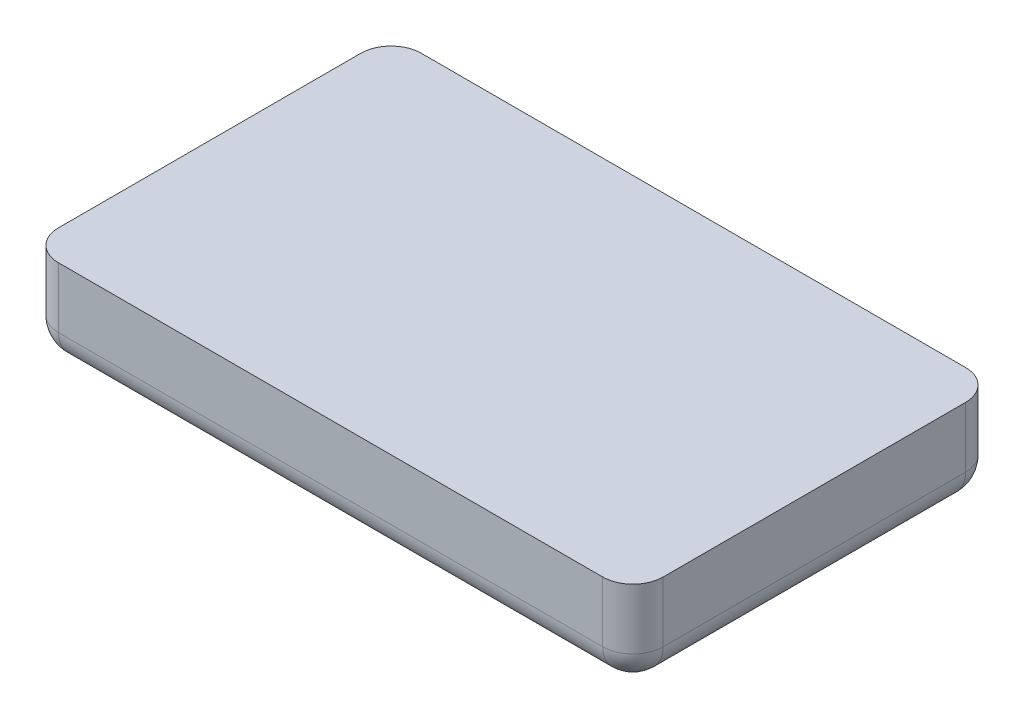
ISO-10303-21;
HEADER;
FILE_DESCRIPTION(('STEP AP214'),'2;1');
FILE_NAME('part.step','',(''),(''),'','','');
FILE_SCHEMA(('AUTOMOTIVE_DESIGN { 1 0 10303 214 1 1 1 1 }'));
ENDSEC;
DATA;
#1=APPLICATION_CONTEXT('core data for automotive mechanical design processes');
#2=APPLICATION_PROTOCOL_DEFINITION('international standard','automotive_design',2000,#1);
#3=PRODUCT_CONTEXT('',#1,'mechanical');
#4=PRODUCT('Part','Part','',(#3));
#5=PRODUCT_RELATED_PRODUCT_CATEGORY('part','',(#4));
#6=PRODUCT_DEFINITION_FORMATION('','',#4);
#7=PRODUCT_DEFINITION_CONTEXT('part definition',#1,'design');
#8=PRODUCT_DEFINITION('design','',#6,#7);
#9=PRODUCT_DEFINITION_SHAPE('','',#8);
#10=(LENGTH_UNIT() NAMED_UNIT(*) SI_UNIT(.MILLI.,.METRE.));
#11=(NAMED_UNIT(*) PLANE_ANGLE_UNIT() SI_UNIT($,.RADIAN.));
#12=(NAMED_UNIT(*) SI_UNIT($,.STERADIAN.) SOLID_ANGLE_UNIT());
#13=UNCERTAINTY_MEASURE_WITH_UNIT(LENGTH_MEASURE(1.E-05),#10,'distance_accuracy_value','');
#14=(GEOMETRIC_REPRESENTATION_CONTEXT(3) GLOBAL_UNCERTAINTY_ASSIGNED_CONTEXT((#13)) GLOBAL_UNIT_ASSIGNED_CONTEXT((#10,
#11,#12)) REPRESENTATION_CONTEXT('',''));
#15=CARTESIAN_POINT('',(0.,0.,0.));
#16=DIRECTION('',(0.,0.,1.));
#17=DIRECTION('',(1.,0.,0.));
#18=AXIS2_PLACEMENT_3D('',#15,#16,#17);
#19=CARTESIAN_POINT('',(0.,30.,0.));
#20=DIRECTION('',(1.,0.,0.));
#21=DIRECTION('',(0.,0.,-1.));
#22=AXIS2_PLACEMENT_3D('',#19,#20,#21);
#23=PLANE('',#22);
#24=DIRECTION('',(0.,0.,1.));
#25=VECTOR('',#24,1.);
#26=CARTESIAN_POINT('',(0.,30.,0.));
#27=LINE('',#26,#25);
#28=CARTESIAN_POINT('',(0.,30.,-110.));
#29=VERTEX_POINT('',#28);
#30=CARTESIAN_POINT('',(0.,30.,-10.));
#31=VERTEX_POINT('',#30);
#32=EDGE_CURVE('E198',#29,#31,#27,.T.);
#33=ORIENTED_EDGE('',*,*,#32,.F.);
#34=DIRECTION('',(0.,-1.,0.));
#35=VECTOR('',#34,1.);
#36=CARTESIAN_POINT('',(0.,30.,-110.));
#37=LINE('',#36,#35);
#38=CARTESIAN_POINT('',(0.,10.,-110.));
#39=VERTEX_POINT('',#38);
#40=EDGE_CURVE('E153',#29,#39,#37,.T.);
#41=ORIENTED_EDGE('',*,*,#40,.T.);
#42=DIRECTION('',(0.,0.,1.));
#43=VECTOR('',#42,1.);
#44=CARTESIAN_POINT('',(0.,10.,0.));
#45=LINE('',#44,#43);
#46=CARTESIAN_POINT('',(0.,10.,-10.));
#47=VERTEX_POINT('',#46);
#48=EDGE_CURVE('E151',#39,#47,#45,.T.);
#49=ORIENTED_EDGE('',*,*,#48,.T.);
#50=DIRECTION('',(0.,-1.,0.));
#51=VECTOR('',#50,1.);
#52=CARTESIAN_POINT('',(0.,30.,-10.));
#53=LINE('',#52,#51);
#54=EDGE_CURVE('E149',#47,#31,#53,.F.);
#55=ORIENTED_EDGE('',*,*,#54,.T.);
#56=EDGE_LOOP('',(#33,#41,#49,#55));
#57=FACE_BOUND('',#56,.T.);
#58=ADVANCED_FACE('F32',(#57),#23,.F.);
#59=CARTESIAN_POINT('',(0.,30.,0.));
#60=DIRECTION('',(0.,0.,-1.));
#61=DIRECTION('',(-1.,0.,0.));
#62=AXIS2_PLACEMENT_3D('',#59,#60,#61);
#63=PLANE('',#62);
#64=DIRECTION('',(1.,0.,0.));
#65=VECTOR('',#64,1.);
#66=CARTESIAN_POINT('',(200.,10.,0.));
#67=LINE('',#66,#65);
#68=CARTESIAN_POINT('',(10.,10.,0.));
#69=VERTEX_POINT('',#68);
#70=CARTESIAN_POINT('',(190.,10.,0.));
#71=VERTEX_POINT('',#70);
#72=EDGE_CURVE('E49',#69,#71,#67,.T.);
#73=ORIENTED_EDGE('',*,*,#72,.T.);
#74=DIRECTION('',(0.,-1.,0.));
#75=VECTOR('',#74,1.);
#76=CARTESIAN_POINT('',(190.,30.,0.));
#77=LINE('',#76,#75);
#78=CARTESIAN_POINT('',(190.,30.,0.));
#79=VERTEX_POINT('',#78);
#80=EDGE_CURVE('E163',#71,#79,#77,.F.);
#81=ORIENTED_EDGE('',*,*,#80,.T.);
#82=DIRECTION('',(1.,0.,0.));
#83=VECTOR('',#82,1.);
#84=CARTESIAN_POINT('',(0.,30.,0.));
#85=LINE('',#84,#83);
#86=CARTESIAN_POINT('',(10.,30.,0.));
#87=VERTEX_POINT('',#86);
#88=EDGE_CURVE('E115',#87,#79,#85,.T.);
#89=ORIENTED_EDGE('',*,*,#88,.F.);
#90=DIRECTION('',(0.,-1.,0.));
#91=VECTOR('',#90,1.);
#92=CARTESIAN_POINT('',(10.,30.,0.));
#93=LINE('',#92,#91);
#94=EDGE_CURVE('E54',#87,#69,#93,.T.);
#95=ORIENTED_EDGE('',*,*,#94,.T.);
#96=EDGE_LOOP('',(#73,#81,#89,#95));
#97=FACE_BOUND('',#96,.T.);
#98=ADVANCED_FACE('F251',(#97),#63,.F.);
#99=CARTESIAN_POINT('',(200.,30.,0.));
#100=DIRECTION('',(-1.,0.,0.));
#101=DIRECTION('',(0.,0.,1.));
#102=AXIS2_PLACEMENT_3D('',#99,#100,#101);
#103=PLANE('',#102);
#104=DIRECTION('',(0.,0.,-1.));
#105=VECTOR('',#104,1.);
#106=CARTESIAN_POINT('',(200.,10.,-120.));
#107=LINE('',#106,#105);
#108=CARTESIAN_POINT('',(200.,10.,-10.));
#109=VERTEX_POINT('',#108);
#110=CARTESIAN_POINT('',(200.,10.,-110.));
#111=VERTEX_POINT('',#110);
#112=EDGE_CURVE('E133',#109,#111,#107,.T.);
#113=ORIENTED_EDGE('',*,*,#112,.T.);
#114=DIRECTION('',(0.,-1.,0.));
#115=VECTOR('',#114,1.);
#116=CARTESIAN_POINT('',(200.,30.,-110.));
#117=LINE('',#116,#115);
#118=CARTESIAN_POINT('',(200.,30.,-110.));
#119=VERTEX_POINT('',#118);
#120=EDGE_CURVE('E126',#111,#119,#117,.F.);
#121=ORIENTED_EDGE('',*,*,#120,.T.);
#122=DIRECTION('',(0.,0.,-1.));
#123=VECTOR('',#122,1.);
#124=CARTESIAN_POINT('',(200.,30.,0.));
#125=LINE('',#124,#123);
#126=CARTESIAN_POINT('',(200.,30.,-10.));
#127=VERTEX_POINT('',#126);
#128=EDGE_CURVE('E113',#127,#119,#125,.T.);
#129=ORIENTED_EDGE('',*,*,#128,.F.);
#130=DIRECTION('',(0.,-1.,0.));
#131=VECTOR('',#130,1.);
#132=CARTESIAN_POINT('',(200.,30.,-10.));
#133=LINE('',#132,#131);
#134=EDGE_CURVE('E123',#127,#109,#133,.T.);
#135=ORIENTED_EDGE('',*,*,#134,.T.);
#136=EDGE_LOOP('',(#113,#121,#129,#135));
#137=FACE_BOUND('',#136,.T.);
#138=ADVANCED_FACE('F122',(#137),#103,.F.);
#139=CARTESIAN_POINT('',(0.,30.,-120.));
#140=DIRECTION('',(0.,0.,1.));
#141=DIRECTION('',(1.,0.,0.));
#142=AXIS2_PLACEMENT_3D('',#139,#140,#141);
#143=PLANE('',#142);
#144=DIRECTION('',(-1.,0.,0.));
#145=VECTOR('',#144,1.);
#146=CARTESIAN_POINT('',(0.,30.,-120.));
#147=LINE('',#146,#145);
#148=CARTESIAN_POINT('',(190.,30.,-120.));
#149=VERTEX_POINT('',#148);
#150=CARTESIAN_POINT('',(10.,30.,-120.));
#151=VERTEX_POINT('',#150);
#152=EDGE_CURVE('E127',#149,#151,#147,.T.);
#153=ORIENTED_EDGE('',*,*,#152,.F.);
#154=DIRECTION('',(0.,-1.,0.));
#155=VECTOR('',#154,1.);
#156=CARTESIAN_POINT('',(190.,30.,-120.));
#157=LINE('',#156,#155);
#158=CARTESIAN_POINT('',(190.,10.,-120.));
#159=VERTEX_POINT('',#158);
#160=EDGE_CURVE('E159',#149,#159,#157,.T.);
#161=ORIENTED_EDGE('',*,*,#160,.T.);
#162=DIRECTION('',(-1.,0.,0.));
#163=VECTOR('',#162,1.);
#164=CARTESIAN_POINT('',(0.,10.,-120.));
#165=LINE('',#164,#163);
#166=CARTESIAN_POINT('',(10.,10.,-120.));
#167=VERTEX_POINT('',#166);
#168=EDGE_CURVE('E157',#159,#167,#165,.T.);
#169=ORIENTED_EDGE('',*,*,#168,.T.);
#170=DIRECTION('',(0.,-1.,0.));
#171=VECTOR('',#170,1.);
#172=CARTESIAN_POINT('',(10.,30.,-120.));
#173=LINE('',#172,#171);
#174=EDGE_CURVE('E155',#167,#151,#173,.F.);
#175=ORIENTED_EDGE('',*,*,#174,.T.);
#176=EDGE_LOOP('',(#153,#161,#169,#175));
#177=FACE_BOUND('',#176,.T.);
#178=ADVANCED_FACE('F231',(#177),#143,.F.);
#179=CARTESIAN_POINT('',(0.,30.,0.));
#180=DIRECTION('',(0.,-1.,0.));
#181=DIRECTION('',(0.,0.,-1.));
#182=AXIS2_PLACEMENT_3D('',#179,#180,#181);
#183=PLANE('',#182);
#184=ORIENTED_EDGE('',*,*,#128,.T.);
#185=CARTESIAN_POINT('',(190.,30.,-110.));
#186=DIRECTION('',(0.,-1.,0.));
#187=DIRECTION('',(0.,0.,-1.));
#188=AXIS2_PLACEMENT_3D('',#185,#186,#187);
#189=CIRCLE('',#188,10.);
#190=EDGE_CURVE('E11',#119,#149,#189,.F.);
#191=ORIENTED_EDGE('',*,*,#190,.T.);
#192=ORIENTED_EDGE('',*,*,#152,.T.);
#193=CARTESIAN_POINT('',(10.,30.,-110.));
#194=DIRECTION('',(0.,-1.,0.));
#195=DIRECTION('',(0.,0.,-1.));
#196=AXIS2_PLACEMENT_3D('',#193,#194,#195);
#197=CIRCLE('',#196,10.);
#198=EDGE_CURVE('E118',#151,#29,#197,.F.);
#199=ORIENTED_EDGE('',*,*,#198,.T.);
#200=ORIENTED_EDGE('',*,*,#32,.T.);
#201=CARTESIAN_POINT('',(10.,30.,-10.));
#202=DIRECTION('',(0.,-1.,0.));
#203=DIRECTION('',(0.,0.,-1.));
#204=AXIS2_PLACEMENT_3D('',#201,#202,#203);
#205=CIRCLE('',#204,10.);
#206=EDGE_CURVE('E165',#31,#87,#205,.F.);
#207=ORIENTED_EDGE('',*,*,#206,.T.);
#208=ORIENTED_EDGE('',*,*,#88,.T.);
#209=CARTESIAN_POINT('',(190.,30.,-10.));
#210=DIRECTION('',(0.,-1.,0.));
#211=DIRECTION('',(0.,0.,-1.));
#212=AXIS2_PLACEMENT_3D('',#209,#210,#211);
#213=CIRCLE('',#212,10.);
#214=EDGE_CURVE('E41',#79,#127,#213,.F.);
#215=ORIENTED_EDGE('',*,*,#214,.T.);
#216=EDGE_LOOP('',(#184,#191,#192,#199,#200,#207,#208,#215));
#217=FACE_BOUND('',#216,.T.);
#218=ADVANCED_FACE('F112',(#217),#183,.F.);
#219=CARTESIAN_POINT('',(0.,0.,0.));
#220=DIRECTION('',(0.,-1.,0.));
#221=DIRECTION('',(0.,0.,-1.));
#222=AXIS2_PLACEMENT_3D('',#219,#220,#221);
#223=PLANE('',#222);
#224=DIRECTION('',(0.,0.,1.));
#225=VECTOR('',#224,1.);
#226=CARTESIAN_POINT('',(10.,0.,-120.));
#227=LINE('',#226,#225);
#228=CARTESIAN_POINT('',(10.,0.,-10.));
#229=VERTEX_POINT('',#228);
#230=CARTESIAN_POINT('',(10.,0.,-110.));
#231=VERTEX_POINT('',#230);
#232=EDGE_CURVE('E142',#229,#231,#227,.F.);
#233=ORIENTED_EDGE('',*,*,#232,.T.);
#234=DIRECTION('',(-1.,0.,0.));
#235=VECTOR('',#234,1.);
#236=CARTESIAN_POINT('',(200.,0.,-110.));
#237=LINE('',#236,#235);
#238=CARTESIAN_POINT('',(190.,0.,-110.));
#239=VERTEX_POINT('',#238);
#240=EDGE_CURVE('E147',#231,#239,#237,.F.);
#241=ORIENTED_EDGE('',*,*,#240,.T.);
#242=DIRECTION('',(0.,0.,-1.));
#243=VECTOR('',#242,1.);
#244=CARTESIAN_POINT('',(190.,0.,0.));
#245=LINE('',#244,#243);
#246=CARTESIAN_POINT('',(190.,0.,-10.));
#247=VERTEX_POINT('',#246);
#248=EDGE_CURVE('E144',#239,#247,#245,.F.);
#249=ORIENTED_EDGE('',*,*,#248,.T.);
#250=DIRECTION('',(1.,0.,0.));
#251=VECTOR('',#250,1.);
#252=CARTESIAN_POINT('',(0.,0.,-10.));
#253=LINE('',#252,#251);
#254=EDGE_CURVE('E140',#247,#229,#253,.F.);
#255=ORIENTED_EDGE('',*,*,#254,.T.);
#256=EDGE_LOOP('',(#233,#241,#249,#255));
#257=FACE_BOUND('',#256,.T.);
#258=ADVANCED_FACE('F245',(#257),#223,.T.);
#259=CARTESIAN_POINT('',(10.,30.,-10.));
#260=DIRECTION('',(0.,-1.,0.));
#261=DIRECTION('',(0.,0.,-1.));
#262=AXIS2_PLACEMENT_3D('',#259,#260,#261);
#263=CYLINDRICAL_SURFACE('',#262,10.);
#264=ORIENTED_EDGE('',*,*,#206,.F.);
#265=ORIENTED_EDGE('',*,*,#54,.F.);
#266=CARTESIAN_POINT('',(10.,10.,-10.));
#267=DIRECTION('',(0.,-1.,0.));
#268=DIRECTION('',(0.,0.,-1.));
#269=AXIS2_PLACEMENT_3D('',#266,#267,#268);
#270=CIRCLE('',#269,10.);
#271=EDGE_CURVE('E193',#69,#47,#270,.T.);
#272=ORIENTED_EDGE('',*,*,#271,.F.);
#273=ORIENTED_EDGE('',*,*,#94,.F.);
#274=EDGE_LOOP('',(#264,#265,#272,#273));
#275=FACE_BOUND('',#274,.T.);
#276=ADVANCED_FACE('F34',(#275),#263,.T.);
#277=CARTESIAN_POINT('',(10.,30.,-110.));
#278=DIRECTION('',(0.,-1.,0.));
#279=DIRECTION('',(0.,0.,-1.));
#280=AXIS2_PLACEMENT_3D('',#277,#278,#279);
#281=CYLINDRICAL_SURFACE('',#280,10.);
#282=ORIENTED_EDGE('',*,*,#198,.F.);
#283=ORIENTED_EDGE('',*,*,#174,.F.);
#284=CARTESIAN_POINT('',(10.,10.,-110.));
#285=DIRECTION('',(0.,-1.,0.));
#286=DIRECTION('',(0.,0.,-1.));
#287=AXIS2_PLACEMENT_3D('',#284,#285,#286);
#288=CIRCLE('',#287,10.);
#289=EDGE_CURVE('E191',#39,#167,#288,.T.);
#290=ORIENTED_EDGE('',*,*,#289,.F.);
#291=ORIENTED_EDGE('',*,*,#40,.F.);
#292=EDGE_LOOP('',(#282,#283,#290,#291));
#293=FACE_BOUND('',#292,.T.);
#294=ADVANCED_FACE('F236',(#293),#281,.T.);
#295=CARTESIAN_POINT('',(10.,10.,0.));
#296=DIRECTION('',(0.,0.,-1.));
#297=DIRECTION('',(-1.,0.,0.));
#298=AXIS2_PLACEMENT_3D('',#295,#296,#297);
#299=CYLINDRICAL_SURFACE('',#298,10.);
#300=CARTESIAN_POINT('',(10.,10.,-10.));
#301=DIRECTION('',(0.,0.,1.));
#302=DIRECTION('',(1.,0.,0.));
#303=AXIS2_PLACEMENT_3D('',#300,#301,#302);
#304=CIRCLE('',#303,10.);
#305=EDGE_CURVE('E36',#47,#229,#304,.T.);
#306=ORIENTED_EDGE('',*,*,#305,.F.);
#307=ORIENTED_EDGE('',*,*,#48,.F.);
#308=CARTESIAN_POINT('',(10.,10.,-110.));
#309=DIRECTION('',(0.,0.,-1.));
#310=DIRECTION('',(-1.,0.,0.));
#311=AXIS2_PLACEMENT_3D('',#308,#309,#310);
#312=CIRCLE('',#311,10.);
#313=EDGE_CURVE('E188',#231,#39,#312,.T.);
#314=ORIENTED_EDGE('',*,*,#313,.F.);
#315=ORIENTED_EDGE('',*,*,#232,.F.);
#316=EDGE_LOOP('',(#306,#307,#314,#315));
#317=FACE_BOUND('',#316,.T.);
#318=ADVANCED_FACE('F249',(#317),#299,.T.);
#319=CARTESIAN_POINT('',(10.,10.,-10.));
#320=DIRECTION('',(0.,0.,1.));
#321=DIRECTION('',(1.,0.,0.));
#322=AXIS2_PLACEMENT_3D('',#319,#320,#321);
#323=SPHERICAL_SURFACE('',#322,10.);
#324=ORIENTED_EDGE('',*,*,#271,.T.);
#325=ORIENTED_EDGE('',*,*,#305,.T.);
#326=CARTESIAN_POINT('',(10.,10.,-10.));
#327=DIRECTION('',(-1.,0.,0.));
#328=DIRECTION('',(0.,0.,1.));
#329=AXIS2_PLACEMENT_3D('',#326,#327,#328);
#330=CIRCLE('',#329,10.);
#331=EDGE_CURVE('E185',#69,#229,#330,.F.);
#332=ORIENTED_EDGE('',*,*,#331,.F.);
#333=EDGE_LOOP('',(#324,#325,#332));
#334=FACE_BOUND('',#333,.T.);
#335=ADVANCED_FACE('F210',(#334),#323,.T.);
#336=CARTESIAN_POINT('',(10.,10.,-110.));
#337=DIRECTION('',(0.,0.,1.));
#338=DIRECTION('',(1.,0.,0.));
#339=AXIS2_PLACEMENT_3D('',#336,#337,#338);
#340=SPHERICAL_SURFACE('',#339,10.);
#341=ORIENTED_EDGE('',*,*,#313,.T.);
#342=ORIENTED_EDGE('',*,*,#289,.T.);
#343=CARTESIAN_POINT('',(10.,10.,-110.));
#344=DIRECTION('',(-1.,0.,0.));
#345=DIRECTION('',(0.,0.,1.));
#346=AXIS2_PLACEMENT_3D('',#343,#344,#345);
#347=CIRCLE('',#346,10.);
#348=EDGE_CURVE('E182',#231,#167,#347,.F.);
#349=ORIENTED_EDGE('',*,*,#348,.F.);
#350=EDGE_LOOP('',(#341,#342,#349));
#351=FACE_BOUND('',#350,.T.);
#352=ADVANCED_FACE('F239',(#351),#340,.T.);
#353=CARTESIAN_POINT('',(0.,10.,-10.));
#354=DIRECTION('',(-1.,0.,0.));
#355=DIRECTION('',(0.,0.,1.));
#356=AXIS2_PLACEMENT_3D('',#353,#354,#355);
#357=CYLINDRICAL_SURFACE('',#356,10.);
#358=ORIENTED_EDGE('',*,*,#331,.T.);
#359=ORIENTED_EDGE('',*,*,#254,.F.);
#360=CARTESIAN_POINT('',(190.,10.,-10.));
#361=DIRECTION('',(1.,0.,0.));
#362=DIRECTION('',(0.,0.,-1.));
#363=AXIS2_PLACEMENT_3D('',#360,#361,#362);
#364=CIRCLE('',#363,10.);
#365=EDGE_CURVE('E179',#71,#247,#364,.T.);
#366=ORIENTED_EDGE('',*,*,#365,.F.);
#367=ORIENTED_EDGE('',*,*,#72,.F.);
#368=EDGE_LOOP('',(#358,#359,#366,#367));
#369=FACE_BOUND('',#368,.T.);
#370=ADVANCED_FACE('F214',(#369),#357,.T.);
#371=CARTESIAN_POINT('',(190.,30.,-10.));
#372=DIRECTION('',(0.,-1.,0.));
#373=DIRECTION('',(0.,0.,-1.));
#374=AXIS2_PLACEMENT_3D('',#371,#372,#373);
#375=CYLINDRICAL_SURFACE('',#374,10.);
#376=ORIENTED_EDGE('',*,*,#214,.F.);
#377=ORIENTED_EDGE('',*,*,#80,.F.);
#378=CARTESIAN_POINT('',(190.,10.,-10.));
#379=DIRECTION('',(0.,-1.,0.));
#380=DIRECTION('',(0.,0.,-1.));
#381=AXIS2_PLACEMENT_3D('',#378,#379,#380);
#382=CIRCLE('',#381,10.);
#383=EDGE_CURVE('E131',#109,#71,#382,.T.);
#384=ORIENTED_EDGE('',*,*,#383,.F.);
#385=ORIENTED_EDGE('',*,*,#134,.F.);
#386=EDGE_LOOP('',(#376,#377,#384,#385));
#387=FACE_BOUND('',#386,.T.);
#388=ADVANCED_FACE('F129',(#387),#375,.T.);
#389=CARTESIAN_POINT('',(190.,30.,-110.));
#390=DIRECTION('',(0.,-1.,0.));
#391=DIRECTION('',(0.,0.,-1.));
#392=AXIS2_PLACEMENT_3D('',#389,#390,#391);
#393=CYLINDRICAL_SURFACE('',#392,10.);
#394=ORIENTED_EDGE('',*,*,#190,.F.);
#395=ORIENTED_EDGE('',*,*,#120,.F.);
#396=CARTESIAN_POINT('',(190.,10.,-110.));
#397=DIRECTION('',(0.,-1.,0.));
#398=DIRECTION('',(0.,0.,-1.));
#399=AXIS2_PLACEMENT_3D('',#396,#397,#398);
#400=CIRCLE('',#399,10.);
#401=EDGE_CURVE('E175',#159,#111,#400,.T.);
#402=ORIENTED_EDGE('',*,*,#401,.F.);
#403=ORIENTED_EDGE('',*,*,#160,.F.);
#404=EDGE_LOOP('',(#394,#395,#402,#403));
#405=FACE_BOUND('',#404,.T.);
#406=ADVANCED_FACE('F228',(#405),#393,.T.);
#407=CARTESIAN_POINT('',(0.,10.,-110.));
#408=DIRECTION('',(1.,0.,0.));
#409=DIRECTION('',(0.,0.,-1.));
#410=AXIS2_PLACEMENT_3D('',#407,#408,#409);
#411=CYLINDRICAL_SURFACE('',#410,10.);
#412=ORIENTED_EDGE('',*,*,#348,.T.);
#413=ORIENTED_EDGE('',*,*,#168,.F.);
#414=CARTESIAN_POINT('',(190.,10.,-110.));
#415=DIRECTION('',(1.,0.,0.));
#416=DIRECTION('',(0.,0.,-1.));
#417=AXIS2_PLACEMENT_3D('',#414,#415,#416);
#418=CIRCLE('',#417,10.);
#419=EDGE_CURVE('E172',#239,#159,#418,.T.);
#420=ORIENTED_EDGE('',*,*,#419,.F.);
#421=ORIENTED_EDGE('',*,*,#240,.F.);
#422=EDGE_LOOP('',(#412,#413,#420,#421));
#423=FACE_BOUND('',#422,.T.);
#424=ADVANCED_FACE('F243',(#423),#411,.T.);
#425=CARTESIAN_POINT('',(190.,10.,-10.));
#426=DIRECTION('',(0.,0.,1.));
#427=DIRECTION('',(1.,0.,0.));
#428=AXIS2_PLACEMENT_3D('',#425,#426,#427);
#429=SPHERICAL_SURFACE('',#428,10.);
#430=ORIENTED_EDGE('',*,*,#383,.T.);
#431=ORIENTED_EDGE('',*,*,#365,.T.);
#432=CARTESIAN_POINT('',(190.,10.,-10.));
#433=DIRECTION('',(0.,0.,1.));
#434=DIRECTION('',(1.,0.,0.));
#435=AXIS2_PLACEMENT_3D('',#432,#433,#434);
#436=CIRCLE('',#435,10.);
#437=EDGE_CURVE('E170',#109,#247,#436,.F.);
#438=ORIENTED_EDGE('',*,*,#437,.F.);
#439=EDGE_LOOP('',(#430,#431,#438));
#440=FACE_BOUND('',#439,.T.);
#441=ADVANCED_FACE('F216',(#440),#429,.T.);
#442=CARTESIAN_POINT('',(190.,10.,-110.));
#443=DIRECTION('',(0.,0.,1.));
#444=DIRECTION('',(1.,0.,0.));
#445=AXIS2_PLACEMENT_3D('',#442,#443,#444);
#446=SPHERICAL_SURFACE('',#445,10.);
#447=ORIENTED_EDGE('',*,*,#419,.T.);
#448=ORIENTED_EDGE('',*,*,#401,.T.);
#449=CARTESIAN_POINT('',(190.,10.,-110.));
#450=DIRECTION('',(0.,0.,-1.));
#451=DIRECTION('',(-1.,0.,0.));
#452=AXIS2_PLACEMENT_3D('',#449,#450,#451);
#453=CIRCLE('',#452,10.);
#454=EDGE_CURVE('E168',#239,#111,#453,.F.);
#455=ORIENTED_EDGE('',*,*,#454,.F.);
#456=EDGE_LOOP('',(#447,#448,#455));
#457=FACE_BOUND('',#456,.T.);
#458=ADVANCED_FACE('F224',(#457),#446,.T.);
#459=CARTESIAN_POINT('',(190.,10.,0.));
#460=DIRECTION('',(0.,0.,1.));
#461=DIRECTION('',(1.,0.,0.));
#462=AXIS2_PLACEMENT_3D('',#459,#460,#461);
#463=CYLINDRICAL_SURFACE('',#462,10.);
#464=ORIENTED_EDGE('',*,*,#437,.T.);
#465=ORIENTED_EDGE('',*,*,#248,.F.);
#466=ORIENTED_EDGE('',*,*,#454,.T.);
#467=ORIENTED_EDGE('',*,*,#112,.F.);
#468=EDGE_LOOP('',(#464,#465,#466,#467));
#469=FACE_BOUND('',#468,.T.);
#470=ADVANCED_FACE('F220',(#469),#463,.T.);
#471=CLOSED_SHELL('',(#58,#98,#138,#178,#218,#258,#276,#294,#318,#335,#352,#370,#388,#406,#424,
#441,#458,#470));
#472=MANIFOLD_SOLID_BREP('B2',#471);
#473=ADVANCED_BREP_SHAPE_REPRESENTATION('',(#18,#472),#14);
#474=SHAPE_DEFINITION_REPRESENTATION(#9,#473);
ENDSEC;
END-ISO-10303-21;
